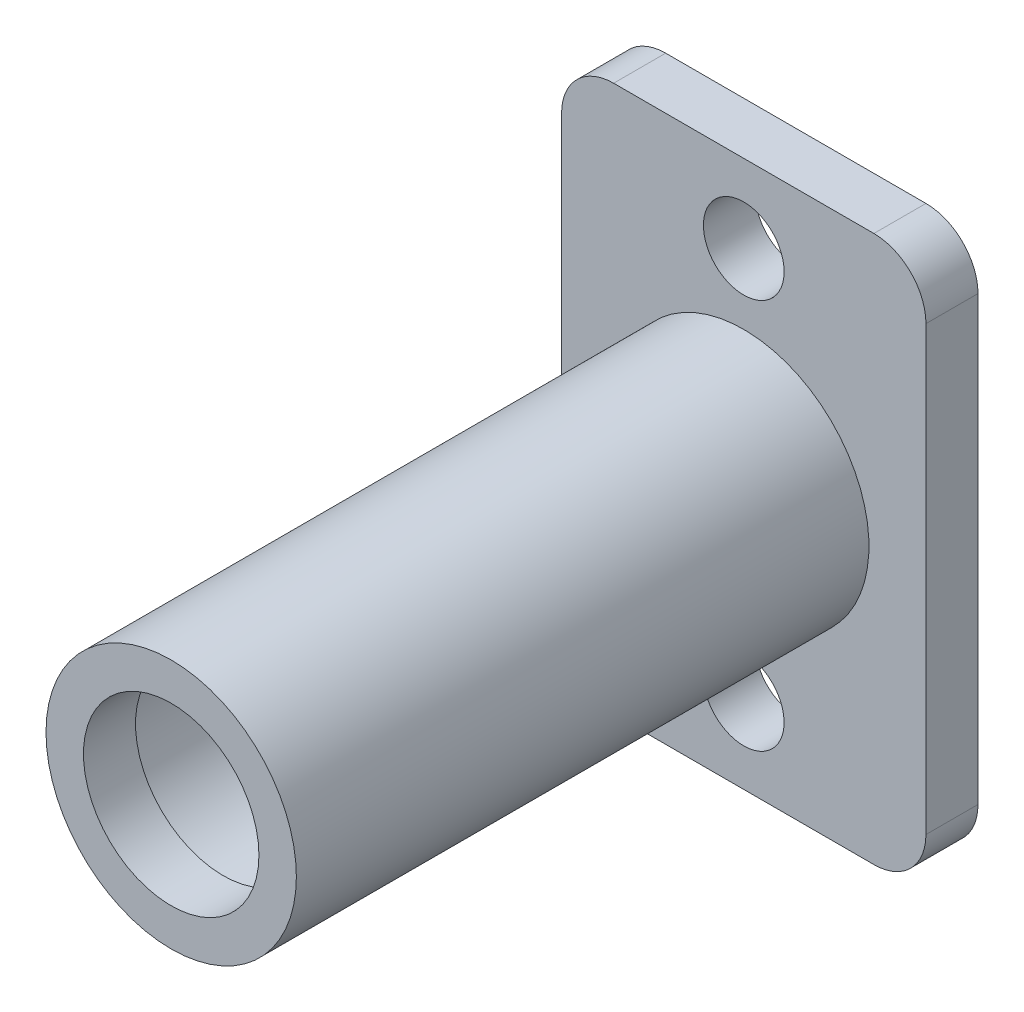
ISO-10303-21;
HEADER;
FILE_DESCRIPTION(('STEP AP214'),'2;1');
FILE_NAME('part.step','',(''),(''),'','','');
FILE_SCHEMA(('AUTOMOTIVE_DESIGN { 1 0 10303 214 1 1 1 1 }'));
ENDSEC;
DATA;
#1=APPLICATION_CONTEXT('core data for automotive mechanical design processes');
#2=APPLICATION_PROTOCOL_DEFINITION('international standard','automotive_design',2000,#1);
#3=PRODUCT_CONTEXT('',#1,'mechanical');
#4=PRODUCT('Part','Part','',(#3));
#5=PRODUCT_RELATED_PRODUCT_CATEGORY('part','',(#4));
#6=PRODUCT_DEFINITION_FORMATION('','',#4);
#7=PRODUCT_DEFINITION_CONTEXT('part definition',#1,'design');
#8=PRODUCT_DEFINITION('design','',#6,#7);
#9=PRODUCT_DEFINITION_SHAPE('','',#8);
#10=(LENGTH_UNIT() NAMED_UNIT(*) SI_UNIT(.MILLI.,.METRE.));
#11=(NAMED_UNIT(*) PLANE_ANGLE_UNIT() SI_UNIT($,.RADIAN.));
#12=(NAMED_UNIT(*) SI_UNIT($,.STERADIAN.) SOLID_ANGLE_UNIT());
#13=UNCERTAINTY_MEASURE_WITH_UNIT(LENGTH_MEASURE(1.E-05),#10,'distance_accuracy_value','');
#14=(GEOMETRIC_REPRESENTATION_CONTEXT(3) GLOBAL_UNCERTAINTY_ASSIGNED_CONTEXT((#13)) GLOBAL_UNIT_ASSIGNED_CONTEXT((#10,
#11,#12)) REPRESENTATION_CONTEXT('',''));
#15=CARTESIAN_POINT('',(0.,0.,0.));
#16=DIRECTION('',(0.,0.,1.));
#17=DIRECTION('',(1.,0.,0.));
#18=AXIS2_PLACEMENT_3D('',#15,#16,#17);
#19=CARTESIAN_POINT('',(0.,0.,2.));
#20=DIRECTION('',(0.,0.,-1.));
#21=DIRECTION('',(-1.,0.,0.));
#22=AXIS2_PLACEMENT_3D('',#19,#20,#21);
#23=PLANE('',#22);
#24=CARTESIAN_POINT('',(0.,-7.5,2.));
#25=DIRECTION('',(0.,0.,1.));
#26=DIRECTION('',(-1.,0.,0.));
#27=AXIS2_PLACEMENT_3D('',#24,#25,#26);
#28=CIRCLE('',#27,1.55);
#29=CARTESIAN_POINT('',(-1.55,-7.5,2.));
#30=VERTEX_POINT('',#29);
#31=EDGE_CURVE('E179',#30,#30,#28,.T.);
#32=ORIENTED_EDGE('',*,*,#31,.F.);
#33=EDGE_LOOP('',(#32));
#34=FACE_BOUND('',#33,.T.);
#35=CARTESIAN_POINT('',(0.,7.5,2.));
#36=DIRECTION('',(0.,0.,1.));
#37=DIRECTION('',(1.,0.,0.));
#38=AXIS2_PLACEMENT_3D('',#35,#36,#37);
#39=CIRCLE('',#38,1.55);
#40=CARTESIAN_POINT('',(1.55,7.5,2.));
#41=VERTEX_POINT('',#40);
#42=EDGE_CURVE('E167',#41,#41,#39,.T.);
#43=ORIENTED_EDGE('',*,*,#42,.F.);
#44=EDGE_LOOP('',(#43));
#45=FACE_BOUND('',#44,.T.);
#46=DIRECTION('',(-1.,0.,0.));
#47=VECTOR('',#46,1.);
#48=CARTESIAN_POINT('',(-7.00000000000001,10.5,2.));
#49=LINE('',#48,#47);
#50=CARTESIAN_POINT('',(5.,10.5,2.));
#51=VERTEX_POINT('',#50);
#52=CARTESIAN_POINT('',(-5.00000000000001,10.5,2.));
#53=VERTEX_POINT('',#52);
#54=EDGE_CURVE('E174',#51,#53,#49,.T.);
#55=ORIENTED_EDGE('',*,*,#54,.T.);
#56=CARTESIAN_POINT('',(-5.00000000000001,8.49999999999999,2.));
#57=DIRECTION('',(0.,0.,-1.));
#58=DIRECTION('',(-1.,0.,0.));
#59=AXIS2_PLACEMENT_3D('',#56,#57,#58);
#60=CIRCLE('',#59,2.);
#61=CARTESIAN_POINT('',(-7.00000000000001,8.49999999999998,2.));
#62=VERTEX_POINT('',#61);
#63=EDGE_CURVE('E149',#53,#62,#60,.F.);
#64=ORIENTED_EDGE('',*,*,#63,.T.);
#65=DIRECTION('',(0.,-1.,0.));
#66=VECTOR('',#65,1.);
#67=CARTESIAN_POINT('',(-7.00000000000001,-10.5,2.));
#68=LINE('',#67,#66);
#69=CARTESIAN_POINT('',(-7.00000000000001,-8.50000000000001,2.));
#70=VERTEX_POINT('',#69);
#71=EDGE_CURVE('E119',#62,#70,#68,.T.);
#72=ORIENTED_EDGE('',*,*,#71,.T.);
#73=CARTESIAN_POINT('',(-5.00000000000001,-8.50000000000001,2.));
#74=DIRECTION('',(0.,0.,-1.));
#75=DIRECTION('',(-1.,0.,0.));
#76=AXIS2_PLACEMENT_3D('',#73,#74,#75);
#77=CIRCLE('',#76,2.);
#78=CARTESIAN_POINT('',(-5.00000000000001,-10.5,2.));
#79=VERTEX_POINT('',#78);
#80=EDGE_CURVE('E55',#70,#79,#77,.F.);
#81=ORIENTED_EDGE('',*,*,#80,.T.);
#82=DIRECTION('',(1.,0.,0.));
#83=VECTOR('',#82,1.);
#84=CARTESIAN_POINT('',(-7.00000000000001,-10.5,2.));
#85=LINE('',#84,#83);
#86=CARTESIAN_POINT('',(5.,-10.5,2.));
#87=VERTEX_POINT('',#86);
#88=EDGE_CURVE('E135',#79,#87,#85,.T.);
#89=ORIENTED_EDGE('',*,*,#88,.T.);
#90=CARTESIAN_POINT('',(5.00000000000001,-8.50000000000001,2.));
#91=DIRECTION('',(0.,0.,-1.));
#92=DIRECTION('',(-1.,0.,0.));
#93=AXIS2_PLACEMENT_3D('',#90,#91,#92);
#94=CIRCLE('',#93,2.);
#95=CARTESIAN_POINT('',(7.00000000000001,-8.50000000000001,2.));
#96=VERTEX_POINT('',#95);
#97=EDGE_CURVE('E146',#87,#96,#94,.F.);
#98=ORIENTED_EDGE('',*,*,#97,.T.);
#99=DIRECTION('',(0.,1.,0.));
#100=VECTOR('',#99,1.);
#101=CARTESIAN_POINT('',(7.00000000000001,-10.5,2.));
#102=LINE('',#101,#100);
#103=CARTESIAN_POINT('',(7.00000000000001,8.49999999999998,2.));
#104=VERTEX_POINT('',#103);
#105=EDGE_CURVE('E129',#96,#104,#102,.T.);
#106=ORIENTED_EDGE('',*,*,#105,.T.);
#107=CARTESIAN_POINT('',(5.00000000000001,8.49999999999999,2.));
#108=DIRECTION('',(0.,0.,-1.));
#109=DIRECTION('',(-1.,0.,0.));
#110=AXIS2_PLACEMENT_3D('',#107,#108,#109);
#111=CIRCLE('',#110,2.);
#112=EDGE_CURVE('E144',#104,#51,#111,.F.);
#113=ORIENTED_EDGE('',*,*,#112,.T.);
#114=EDGE_LOOP('',(#55,#64,#72,#81,#89,#98,#106,#113));
#115=FACE_BOUND('',#114,.T.);
#116=CARTESIAN_POINT('',(0.,0.,2.));
#117=DIRECTION('',(0.,0.,-1.));
#118=DIRECTION('',(-1.,0.,0.));
#119=AXIS2_PLACEMENT_3D('',#116,#117,#118);
#120=CIRCLE('',#119,4.81);
#121=CARTESIAN_POINT('',(-4.81,0.,2.));
#122=VERTEX_POINT('',#121);
#123=EDGE_CURVE('E11',#122,#122,#120,.F.);
#124=ORIENTED_EDGE('',*,*,#123,.F.);
#125=EDGE_LOOP('',(#124));
#126=FACE_BOUND('',#125,.T.);
#127=ADVANCED_FACE('F33',(#34,#45,#115,#126),#23,.F.);
#128=CARTESIAN_POINT('',(0.,0.,0.));
#129=DIRECTION('',(0.,0.,-1.));
#130=DIRECTION('',(-1.,0.,0.));
#131=AXIS2_PLACEMENT_3D('',#128,#129,#130);
#132=PLANE('',#131);
#133=CARTESIAN_POINT('',(0.,-7.5,0.));
#134=DIRECTION('',(0.,0.,1.));
#135=DIRECTION('',(-1.,0.,0.));
#136=AXIS2_PLACEMENT_3D('',#133,#134,#135);
#137=CIRCLE('',#136,1.55);
#138=CARTESIAN_POINT('',(-1.55,-7.5,0.));
#139=VERTEX_POINT('',#138);
#140=EDGE_CURVE('E181',#139,#139,#137,.T.);
#141=ORIENTED_EDGE('',*,*,#140,.T.);
#142=EDGE_LOOP('',(#141));
#143=FACE_BOUND('',#142,.T.);
#144=DIRECTION('',(0.,-1.,0.));
#145=VECTOR('',#144,1.);
#146=CARTESIAN_POINT('',(-7.00000000000001,-10.5,0.));
#147=LINE('',#146,#145);
#148=CARTESIAN_POINT('',(-7.00000000000001,8.49999999999998,0.));
#149=VERTEX_POINT('',#148);
#150=CARTESIAN_POINT('',(-7.00000000000001,-8.50000000000001,0.));
#151=VERTEX_POINT('',#150);
#152=EDGE_CURVE('E117',#149,#151,#147,.T.);
#153=ORIENTED_EDGE('',*,*,#152,.F.);
#154=CARTESIAN_POINT('',(-5.00000000000001,8.49999999999999,0.));
#155=DIRECTION('',(0.,0.,-1.));
#156=DIRECTION('',(-1.,0.,0.));
#157=AXIS2_PLACEMENT_3D('',#154,#155,#156);
#158=CIRCLE('',#157,2.);
#159=CARTESIAN_POINT('',(-5.00000000000001,10.5,0.));
#160=VERTEX_POINT('',#159);
#161=EDGE_CURVE('E100',#149,#160,#158,.T.);
#162=ORIENTED_EDGE('',*,*,#161,.T.);
#163=DIRECTION('',(-1.,0.,0.));
#164=VECTOR('',#163,1.);
#165=CARTESIAN_POINT('',(-7.00000000000001,10.5,0.));
#166=LINE('',#165,#164);
#167=CARTESIAN_POINT('',(5.,10.5,0.));
#168=VERTEX_POINT('',#167);
#169=EDGE_CURVE('E127',#168,#160,#166,.T.);
#170=ORIENTED_EDGE('',*,*,#169,.F.);
#171=CARTESIAN_POINT('',(5.00000000000001,8.49999999999999,0.));
#172=DIRECTION('',(0.,0.,-1.));
#173=DIRECTION('',(-1.,0.,0.));
#174=AXIS2_PLACEMENT_3D('',#171,#172,#173);
#175=CIRCLE('',#174,2.);
#176=CARTESIAN_POINT('',(7.00000000000001,8.49999999999998,0.));
#177=VERTEX_POINT('',#176);
#178=EDGE_CURVE('E120',#168,#177,#175,.T.);
#179=ORIENTED_EDGE('',*,*,#178,.T.);
#180=DIRECTION('',(0.,1.,0.));
#181=VECTOR('',#180,1.);
#182=CARTESIAN_POINT('',(7.00000000000001,-10.5,0.));
#183=LINE('',#182,#181);
#184=CARTESIAN_POINT('',(7.00000000000001,-8.50000000000001,0.));
#185=VERTEX_POINT('',#184);
#186=EDGE_CURVE('E131',#185,#177,#183,.T.);
#187=ORIENTED_EDGE('',*,*,#186,.F.);
#188=CARTESIAN_POINT('',(5.00000000000001,-8.50000000000001,0.));
#189=DIRECTION('',(0.,0.,-1.));
#190=DIRECTION('',(-1.,0.,0.));
#191=AXIS2_PLACEMENT_3D('',#188,#189,#190);
#192=CIRCLE('',#191,2.);
#193=CARTESIAN_POINT('',(5.,-10.5,0.));
#194=VERTEX_POINT('',#193);
#195=EDGE_CURVE('E138',#185,#194,#192,.T.);
#196=ORIENTED_EDGE('',*,*,#195,.T.);
#197=DIRECTION('',(1.,0.,0.));
#198=VECTOR('',#197,1.);
#199=CARTESIAN_POINT('',(-7.00000000000001,-10.5,0.));
#200=LINE('',#199,#198);
#201=CARTESIAN_POINT('',(-5.00000000000001,-10.5,0.));
#202=VERTEX_POINT('',#201);
#203=EDGE_CURVE('E126',#202,#194,#200,.T.);
#204=ORIENTED_EDGE('',*,*,#203,.F.);
#205=CARTESIAN_POINT('',(-5.00000000000001,-8.50000000000001,0.));
#206=DIRECTION('',(0.,0.,-1.));
#207=DIRECTION('',(-1.,0.,0.));
#208=AXIS2_PLACEMENT_3D('',#205,#206,#207);
#209=CIRCLE('',#208,2.);
#210=EDGE_CURVE('E111',#202,#151,#209,.T.);
#211=ORIENTED_EDGE('',*,*,#210,.T.);
#212=EDGE_LOOP('',(#153,#162,#170,#179,#187,#196,#204,#211));
#213=FACE_BOUND('',#212,.T.);
#214=CARTESIAN_POINT('',(0.,7.5,0.));
#215=DIRECTION('',(0.,0.,1.));
#216=DIRECTION('',(1.,0.,0.));
#217=AXIS2_PLACEMENT_3D('',#214,#215,#216);
#218=CIRCLE('',#217,1.55);
#219=CARTESIAN_POINT('',(1.55,7.5,0.));
#220=VERTEX_POINT('',#219);
#221=EDGE_CURVE('E169',#220,#220,#218,.T.);
#222=ORIENTED_EDGE('',*,*,#221,.T.);
#223=EDGE_LOOP('',(#222));
#224=FACE_BOUND('',#223,.T.);
#225=CARTESIAN_POINT('',(0.,0.,0.));
#226=DIRECTION('',(0.,0.,1.));
#227=DIRECTION('',(1.,0.,0.));
#228=AXIS2_PLACEMENT_3D('',#225,#226,#227);
#229=CIRCLE('',#228,3.81);
#230=CARTESIAN_POINT('',(3.81,0.,0.));
#231=VERTEX_POINT('',#230);
#232=EDGE_CURVE('E184',#231,#231,#229,.T.);
#233=ORIENTED_EDGE('',*,*,#232,.T.);
#234=EDGE_LOOP('',(#233));
#235=FACE_BOUND('',#234,.T.);
#236=ADVANCED_FACE('F123',(#143,#213,#224,#235),#132,.T.);
#237=CARTESIAN_POINT('',(7.00000000000001,-10.5,2.));
#238=DIRECTION('',(-1.,0.,0.));
#239=DIRECTION('',(0.,0.,1.));
#240=AXIS2_PLACEMENT_3D('',#237,#238,#239);
#241=PLANE('',#240);
#242=ORIENTED_EDGE('',*,*,#105,.F.);
#243=DIRECTION('',(0.,0.,-1.));
#244=VECTOR('',#243,1.);
#245=CARTESIAN_POINT('',(7.00000000000001,-8.50000000000001,2.));
#246=LINE('',#245,#244);
#247=EDGE_CURVE('E41',#96,#185,#246,.T.);
#248=ORIENTED_EDGE('',*,*,#247,.T.);
#249=ORIENTED_EDGE('',*,*,#186,.T.);
#250=DIRECTION('',(0.,0.,-1.));
#251=VECTOR('',#250,1.);
#252=CARTESIAN_POINT('',(7.00000000000001,8.49999999999999,2.));
#253=LINE('',#252,#251);
#254=EDGE_CURVE('E155',#177,#104,#253,.F.);
#255=ORIENTED_EDGE('',*,*,#254,.T.);
#256=EDGE_LOOP('',(#242,#248,#249,#255));
#257=FACE_BOUND('',#256,.T.);
#258=ADVANCED_FACE('F162',(#257),#241,.F.);
#259=CARTESIAN_POINT('',(-7.00000000000001,10.5,2.));
#260=DIRECTION('',(0.,-1.,0.));
#261=DIRECTION('',(0.,0.,-1.));
#262=AXIS2_PLACEMENT_3D('',#259,#260,#261);
#263=PLANE('',#262);
#264=ORIENTED_EDGE('',*,*,#169,.T.);
#265=DIRECTION('',(0.,0.,-1.));
#266=VECTOR('',#265,1.);
#267=CARTESIAN_POINT('',(-5.00000000000001,10.5,2.));
#268=LINE('',#267,#266);
#269=EDGE_CURVE('E105',#160,#53,#268,.F.);
#270=ORIENTED_EDGE('',*,*,#269,.T.);
#271=ORIENTED_EDGE('',*,*,#54,.F.);
#272=DIRECTION('',(0.,0.,-1.));
#273=VECTOR('',#272,1.);
#274=CARTESIAN_POINT('',(5.00000000000001,10.5,2.));
#275=LINE('',#274,#273);
#276=EDGE_CURVE('E110',#51,#168,#275,.T.);
#277=ORIENTED_EDGE('',*,*,#276,.T.);
#278=EDGE_LOOP('',(#264,#270,#271,#277));
#279=FACE_BOUND('',#278,.T.);
#280=ADVANCED_FACE('F237',(#279),#263,.F.);
#281=CARTESIAN_POINT('',(-7.00000000000001,-10.5,2.));
#282=DIRECTION('',(1.,0.,0.));
#283=DIRECTION('',(0.,0.,-1.));
#284=AXIS2_PLACEMENT_3D('',#281,#282,#283);
#285=PLANE('',#284);
#286=ORIENTED_EDGE('',*,*,#71,.F.);
#287=DIRECTION('',(0.,0.,-1.));
#288=VECTOR('',#287,1.);
#289=CARTESIAN_POINT('',(-7.00000000000001,8.49999999999999,2.));
#290=LINE('',#289,#288);
#291=EDGE_CURVE('E104',#62,#149,#290,.T.);
#292=ORIENTED_EDGE('',*,*,#291,.T.);
#293=ORIENTED_EDGE('',*,*,#152,.T.);
#294=DIRECTION('',(0.,0.,-1.));
#295=VECTOR('',#294,1.);
#296=CARTESIAN_POINT('',(-7.00000000000001,-8.50000000000001,2.));
#297=LINE('',#296,#295);
#298=EDGE_CURVE('E121',#151,#70,#297,.F.);
#299=ORIENTED_EDGE('',*,*,#298,.T.);
#300=EDGE_LOOP('',(#286,#292,#293,#299));
#301=FACE_BOUND('',#300,.T.);
#302=ADVANCED_FACE('F116',(#301),#285,.F.);
#303=CARTESIAN_POINT('',(-7.00000000000001,-10.5,2.));
#304=DIRECTION('',(0.,1.,0.));
#305=DIRECTION('',(0.,0.,1.));
#306=AXIS2_PLACEMENT_3D('',#303,#304,#305);
#307=PLANE('',#306);
#308=ORIENTED_EDGE('',*,*,#88,.F.);
#309=DIRECTION('',(0.,0.,-1.));
#310=VECTOR('',#309,1.);
#311=CARTESIAN_POINT('',(-5.00000000000001,-10.5,2.));
#312=LINE('',#311,#310);
#313=EDGE_CURVE('E152',#79,#202,#312,.T.);
#314=ORIENTED_EDGE('',*,*,#313,.T.);
#315=ORIENTED_EDGE('',*,*,#203,.T.);
#316=DIRECTION('',(0.,0.,-1.));
#317=VECTOR('',#316,1.);
#318=CARTESIAN_POINT('',(5.00000000000001,-10.5,2.));
#319=LINE('',#318,#317);
#320=EDGE_CURVE('E48',#194,#87,#319,.F.);
#321=ORIENTED_EDGE('',*,*,#320,.T.);
#322=EDGE_LOOP('',(#308,#314,#315,#321));
#323=FACE_BOUND('',#322,.T.);
#324=ADVANCED_FACE('F232',(#323),#307,.F.);
#325=CARTESIAN_POINT('',(0.,7.5,2.));
#326=DIRECTION('',(0.,0.,-1.));
#327=DIRECTION('',(-1.,0.,0.));
#328=AXIS2_PLACEMENT_3D('',#325,#326,#327);
#329=CYLINDRICAL_SURFACE('',#328,1.55);
#330=ORIENTED_EDGE('',*,*,#42,.T.);
#331=EDGE_LOOP('',(#330));
#332=FACE_BOUND('',#331,.T.);
#333=ORIENTED_EDGE('',*,*,#221,.F.);
#334=EDGE_LOOP('',(#333));
#335=FACE_BOUND('',#334,.T.);
#336=ADVANCED_FACE('F229',(#332,#335),#329,.F.);
#337=CARTESIAN_POINT('',(0.,-7.5,2.));
#338=DIRECTION('',(0.,0.,-1.));
#339=DIRECTION('',(-1.,0.,0.));
#340=AXIS2_PLACEMENT_3D('',#337,#338,#339);
#341=CYLINDRICAL_SURFACE('',#340,1.55);
#342=ORIENTED_EDGE('',*,*,#31,.T.);
#343=EDGE_LOOP('',(#342));
#344=FACE_BOUND('',#343,.T.);
#345=ORIENTED_EDGE('',*,*,#140,.F.);
#346=EDGE_LOOP('',(#345));
#347=FACE_BOUND('',#346,.T.);
#348=ADVANCED_FACE('F270',(#344,#347),#341,.F.);
#349=CARTESIAN_POINT('',(0.,0.,2.));
#350=DIRECTION('',(0.,0.,-1.));
#351=DIRECTION('',(-1.,0.,0.));
#352=AXIS2_PLACEMENT_3D('',#349,#350,#351);
#353=CYLINDRICAL_SURFACE('',#352,3.81);
#354=ORIENTED_EDGE('',*,*,#232,.F.);
#355=EDGE_LOOP('',(#354));
#356=FACE_BOUND('',#355,.T.);
#357=CARTESIAN_POINT('',(0.,0.,22.));
#358=DIRECTION('',(0.,0.,1.));
#359=DIRECTION('',(1.,0.,0.));
#360=AXIS2_PLACEMENT_3D('',#357,#358,#359);
#361=CIRCLE('',#360,3.81);
#362=CARTESIAN_POINT('',(3.81,0.,22.));
#363=VERTEX_POINT('',#362);
#364=EDGE_CURVE('E189',#363,#363,#361,.T.);
#365=ORIENTED_EDGE('',*,*,#364,.T.);
#366=EDGE_LOOP('',(#365));
#367=FACE_BOUND('',#366,.T.);
#368=ADVANCED_FACE('F246',(#356,#367),#353,.F.);
#369=CARTESIAN_POINT('',(-5.00000000000001,8.49999999999999,2.));
#370=DIRECTION('',(0.,0.,-1.));
#371=DIRECTION('',(-1.,0.,0.));
#372=AXIS2_PLACEMENT_3D('',#369,#370,#371);
#373=CYLINDRICAL_SURFACE('',#372,2.);
#374=ORIENTED_EDGE('',*,*,#63,.F.);
#375=ORIENTED_EDGE('',*,*,#269,.F.);
#376=ORIENTED_EDGE('',*,*,#161,.F.);
#377=ORIENTED_EDGE('',*,*,#291,.F.);
#378=EDGE_LOOP('',(#374,#375,#376,#377));
#379=FACE_BOUND('',#378,.T.);
#380=ADVANCED_FACE('F103',(#379),#373,.T.);
#381=CARTESIAN_POINT('',(-5.00000000000001,-8.50000000000001,2.));
#382=DIRECTION('',(0.,0.,-1.));
#383=DIRECTION('',(-1.,0.,0.));
#384=AXIS2_PLACEMENT_3D('',#381,#382,#383);
#385=CYLINDRICAL_SURFACE('',#384,2.);
#386=ORIENTED_EDGE('',*,*,#80,.F.);
#387=ORIENTED_EDGE('',*,*,#298,.F.);
#388=ORIENTED_EDGE('',*,*,#210,.F.);
#389=ORIENTED_EDGE('',*,*,#313,.F.);
#390=EDGE_LOOP('',(#386,#387,#388,#389));
#391=FACE_BOUND('',#390,.T.);
#392=ADVANCED_FACE('F245',(#391),#385,.T.);
#393=CARTESIAN_POINT('',(5.00000000000001,-8.50000000000001,2.));
#394=DIRECTION('',(0.,0.,-1.));
#395=DIRECTION('',(-1.,0.,0.));
#396=AXIS2_PLACEMENT_3D('',#393,#394,#395);
#397=CYLINDRICAL_SURFACE('',#396,2.);
#398=ORIENTED_EDGE('',*,*,#97,.F.);
#399=ORIENTED_EDGE('',*,*,#320,.F.);
#400=ORIENTED_EDGE('',*,*,#195,.F.);
#401=ORIENTED_EDGE('',*,*,#247,.F.);
#402=EDGE_LOOP('',(#398,#399,#400,#401));
#403=FACE_BOUND('',#402,.T.);
#404=ADVANCED_FACE('F248',(#403),#397,.T.);
#405=CARTESIAN_POINT('',(5.00000000000001,8.49999999999999,2.));
#406=DIRECTION('',(0.,0.,-1.));
#407=DIRECTION('',(-1.,0.,0.));
#408=AXIS2_PLACEMENT_3D('',#405,#406,#407);
#409=CYLINDRICAL_SURFACE('',#408,2.);
#410=ORIENTED_EDGE('',*,*,#112,.F.);
#411=ORIENTED_EDGE('',*,*,#254,.F.);
#412=ORIENTED_EDGE('',*,*,#178,.F.);
#413=ORIENTED_EDGE('',*,*,#276,.F.);
#414=EDGE_LOOP('',(#410,#411,#412,#413));
#415=FACE_BOUND('',#414,.T.);
#416=ADVANCED_FACE('F35',(#415),#409,.T.);
#417=CARTESIAN_POINT('',(0.,0.,22.));
#418=DIRECTION('',(0.,0.,-1.));
#419=DIRECTION('',(-1.,0.,0.));
#420=AXIS2_PLACEMENT_3D('',#417,#418,#419);
#421=CYLINDRICAL_SURFACE('',#420,4.81);
#422=ORIENTED_EDGE('',*,*,#123,.T.);
#423=EDGE_LOOP('',(#422));
#424=FACE_BOUND('',#423,.T.);
#425=CARTESIAN_POINT('',(0.,0.,24.));
#426=DIRECTION('',(0.,0.,1.));
#427=DIRECTION('',(1.,0.,0.));
#428=AXIS2_PLACEMENT_3D('',#425,#426,#427);
#429=CIRCLE('',#428,4.81);
#430=CARTESIAN_POINT('',(4.81,0.,24.));
#431=VERTEX_POINT('',#430);
#432=EDGE_CURVE('E192',#431,#431,#429,.T.);
#433=ORIENTED_EDGE('',*,*,#432,.F.);
#434=EDGE_LOOP('',(#433));
#435=FACE_BOUND('',#434,.T.);
#436=ADVANCED_FACE('F215',(#424,#435),#421,.T.);
#437=CARTESIAN_POINT('',(0.,0.,22.));
#438=DIRECTION('',(0.,0.,1.));
#439=DIRECTION('',(1.,0.,0.));
#440=AXIS2_PLACEMENT_3D('',#437,#438,#439);
#441=PLANE('',#440);
#442=CARTESIAN_POINT('',(0.,0.,22.));
#443=DIRECTION('',(0.,0.,1.));
#444=DIRECTION('',(1.,0.,0.));
#445=AXIS2_PLACEMENT_3D('',#442,#443,#444);
#446=CIRCLE('',#445,3.37120460772578);
#447=CARTESIAN_POINT('',(3.37120460772578,0.,22.));
#448=VERTEX_POINT('',#447);
#449=EDGE_CURVE('E196',#448,#448,#446,.T.);
#450=ORIENTED_EDGE('',*,*,#449,.T.);
#451=EDGE_LOOP('',(#450));
#452=FACE_BOUND('',#451,.T.);
#453=ORIENTED_EDGE('',*,*,#364,.F.);
#454=EDGE_LOOP('',(#453));
#455=FACE_BOUND('',#454,.T.);
#456=ADVANCED_FACE('F207',(#452,#455),#441,.F.);
#457=CARTESIAN_POINT('',(0.,0.,24.));
#458=DIRECTION('',(0.,0.,1.));
#459=DIRECTION('',(1.,0.,0.));
#460=AXIS2_PLACEMENT_3D('',#457,#458,#459);
#461=PLANE('',#460);
#462=ORIENTED_EDGE('',*,*,#432,.T.);
#463=EDGE_LOOP('',(#462));
#464=FACE_BOUND('',#463,.T.);
#465=CARTESIAN_POINT('',(0.,0.,24.));
#466=DIRECTION('',(0.,0.,1.));
#467=DIRECTION('',(1.,0.,0.));
#468=AXIS2_PLACEMENT_3D('',#465,#466,#467);
#469=CIRCLE('',#468,3.37120460772578);
#470=CARTESIAN_POINT('',(3.37120460772578,0.,24.));
#471=VERTEX_POINT('',#470);
#472=EDGE_CURVE('E195',#471,#471,#469,.T.);
#473=ORIENTED_EDGE('',*,*,#472,.F.);
#474=EDGE_LOOP('',(#473));
#475=FACE_BOUND('',#474,.T.);
#476=ADVANCED_FACE('F205',(#464,#475),#461,.T.);
#477=CARTESIAN_POINT('',(0.,0.,24.));
#478=DIRECTION('',(0.,0.,-1.));
#479=DIRECTION('',(-1.,0.,0.));
#480=AXIS2_PLACEMENT_3D('',#477,#478,#479);
#481=CYLINDRICAL_SURFACE('',#480,3.37120460772578);
#482=ORIENTED_EDGE('',*,*,#472,.T.);
#483=EDGE_LOOP('',(#482));
#484=FACE_BOUND('',#483,.T.);
#485=ORIENTED_EDGE('',*,*,#449,.F.);
#486=EDGE_LOOP('',(#485));
#487=FACE_BOUND('',#486,.T.);
#488=ADVANCED_FACE('F202',(#484,#487),#481,.F.);
#489=CLOSED_SHELL('',(#127,#236,#258,#280,#302,#324,#336,#348,#368,#380,#392,#404,#416,#436,
#456,#476,#488));
#490=MANIFOLD_SOLID_BREP('B2',#489);
#491=ADVANCED_BREP_SHAPE_REPRESENTATION('',(#18,#490),#14);
#492=SHAPE_DEFINITION_REPRESENTATION(#9,#491);
ENDSEC;
END-ISO-10303-21;
